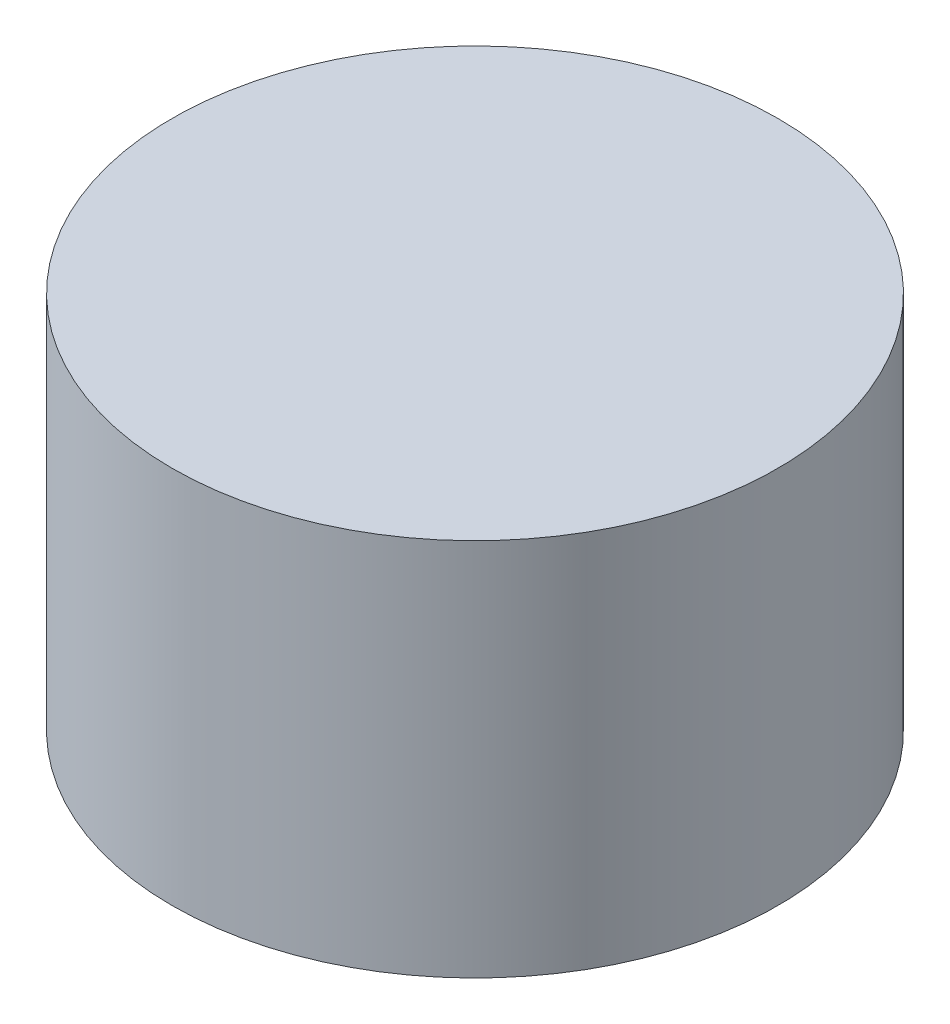
ISO-10303-21;
HEADER;
FILE_DESCRIPTION(('STEP AP214'),'2;1');
FILE_NAME('part.step','',(''),(''),'','','');
FILE_SCHEMA(('AUTOMOTIVE_DESIGN { 1 0 10303 214 1 1 1 1 }'));
ENDSEC;
DATA;
#1=APPLICATION_CONTEXT('core data for automotive mechanical design processes');
#2=APPLICATION_PROTOCOL_DEFINITION('international standard','automotive_design',2000,#1);
#3=PRODUCT_CONTEXT('',#1,'mechanical');
#4=PRODUCT('Part','Part','',(#3));
#5=PRODUCT_RELATED_PRODUCT_CATEGORY('part','',(#4));
#6=PRODUCT_DEFINITION_FORMATION('','',#4);
#7=PRODUCT_DEFINITION_CONTEXT('part definition',#1,'design');
#8=PRODUCT_DEFINITION('design','',#6,#7);
#9=PRODUCT_DEFINITION_SHAPE('','',#8);
#10=(LENGTH_UNIT() NAMED_UNIT(*) SI_UNIT(.MILLI.,.METRE.));
#11=(NAMED_UNIT(*) PLANE_ANGLE_UNIT() SI_UNIT($,.RADIAN.));
#12=(NAMED_UNIT(*) SI_UNIT($,.STERADIAN.) SOLID_ANGLE_UNIT());
#13=UNCERTAINTY_MEASURE_WITH_UNIT(LENGTH_MEASURE(1.E-05),#10,'distance_accuracy_value','');
#14=(GEOMETRIC_REPRESENTATION_CONTEXT(3) GLOBAL_UNCERTAINTY_ASSIGNED_CONTEXT((#13)) GLOBAL_UNIT_ASSIGNED_CONTEXT((#10,
#11,#12)) REPRESENTATION_CONTEXT('',''));
#15=CARTESIAN_POINT('',(0.,0.,0.));
#16=DIRECTION('',(0.,0.,1.));
#17=DIRECTION('',(1.,0.,0.));
#18=AXIS2_PLACEMENT_3D('',#15,#16,#17);
#19=CARTESIAN_POINT('',(0.,50.,0.));
#20=DIRECTION('',(0.,-1.,0.));
#21=DIRECTION('',(0.,0.,-1.));
#22=AXIS2_PLACEMENT_3D('',#19,#20,#21);
#23=CYLINDRICAL_SURFACE('',#22,40.);
#24=CARTESIAN_POINT('',(0.,50.,0.));
#25=DIRECTION('',(0.,1.,0.));
#26=DIRECTION('',(0.,0.,1.));
#27=AXIS2_PLACEMENT_3D('',#24,#25,#26);
#28=CIRCLE('',#27,40.);
#29=CARTESIAN_POINT('',(0.,50.,40.));
#30=VERTEX_POINT('',#29);
#31=EDGE_CURVE('E10',#30,#30,#28,.T.);
#32=ORIENTED_EDGE('',*,*,#31,.F.);
#33=EDGE_LOOP('',(#32));
#34=FACE_BOUND('',#33,.T.);
#35=CARTESIAN_POINT('',(0.,0.,0.));
#36=DIRECTION('',(0.,1.,0.));
#37=DIRECTION('',(0.,0.,1.));
#38=AXIS2_PLACEMENT_3D('',#35,#36,#37);
#39=CIRCLE('',#38,40.);
#40=CARTESIAN_POINT('',(0.,0.,40.));
#41=VERTEX_POINT('',#40);
#42=EDGE_CURVE('E44',#41,#41,#39,.T.);
#43=ORIENTED_EDGE('',*,*,#42,.T.);
#44=EDGE_LOOP('',(#43));
#45=FACE_BOUND('',#44,.T.);
#46=ADVANCED_FACE('F41',(#34,#45),#23,.T.);
#47=CARTESIAN_POINT('',(0.,50.,0.));
#48=DIRECTION('',(0.,1.,0.));
#49=DIRECTION('',(0.,0.,1.));
#50=AXIS2_PLACEMENT_3D('',#47,#48,#49);
#51=PLANE('',#50);
#52=ORIENTED_EDGE('',*,*,#31,.T.);
#53=EDGE_LOOP('',(#52));
#54=FACE_BOUND('',#53,.T.);
#55=ADVANCED_FACE('F83',(#54),#51,.T.);
#56=CARTESIAN_POINT('',(0.,0.,0.));
#57=DIRECTION('',(0.,1.,0.));
#58=DIRECTION('',(0.,0.,1.));
#59=AXIS2_PLACEMENT_3D('',#56,#57,#58);
#60=PLANE('',#59);
#61=CARTESIAN_POINT('',(-17.6776695296635,0.,17.6776695296638));
#62=DIRECTION('',(0.,-1.,0.));
#63=DIRECTION('',(0.,0.,-1.));
#64=AXIS2_PLACEMENT_3D('',#61,#62,#63);
#65=CIRCLE('',#64,3.);
#66=CARTESIAN_POINT('',(-17.6776695296635,0.,14.6776695296638));
#67=VERTEX_POINT('',#66);
#68=EDGE_CURVE('E62',#67,#67,#65,.T.);
#69=ORIENTED_EDGE('',*,*,#68,.F.);
#70=EDGE_LOOP('',(#69));
#71=FACE_BOUND('',#70,.T.);
#72=CARTESIAN_POINT('',(-17.6776695296638,0.,-17.6776695296636));
#73=DIRECTION('',(0.,-1.,0.));
#74=DIRECTION('',(0.,0.,-1.));
#75=AXIS2_PLACEMENT_3D('',#72,#73,#74);
#76=CIRCLE('',#75,3.);
#77=CARTESIAN_POINT('',(-17.6776695296638,0.,-20.6776695296636));
#78=VERTEX_POINT('',#77);
#79=EDGE_CURVE('E68',#78,#78,#76,.T.);
#80=ORIENTED_EDGE('',*,*,#79,.F.);
#81=EDGE_LOOP('',(#80));
#82=FACE_BOUND('',#81,.T.);
#83=CARTESIAN_POINT('',(17.6776695296637,0.,-17.6776695296637));
#84=DIRECTION('',(0.,-1.,0.));
#85=DIRECTION('',(0.,0.,-1.));
#86=AXIS2_PLACEMENT_3D('',#83,#84,#85);
#87=CIRCLE('',#86,3.);
#88=CARTESIAN_POINT('',(17.6776695296637,0.,-20.6776695296637));
#89=VERTEX_POINT('',#88);
#90=EDGE_CURVE('E56',#89,#89,#87,.T.);
#91=ORIENTED_EDGE('',*,*,#90,.F.);
#92=EDGE_LOOP('',(#91));
#93=FACE_BOUND('',#92,.T.);
#94=CARTESIAN_POINT('',(17.6776695296637,0.,17.6776695296637));
#95=DIRECTION('',(0.,-1.,0.));
#96=DIRECTION('',(0.,0.,-1.));
#97=AXIS2_PLACEMENT_3D('',#94,#95,#96);
#98=CIRCLE('',#97,3.);
#99=CARTESIAN_POINT('',(17.6776695296637,0.,14.6776695296637));
#100=VERTEX_POINT('',#99);
#101=EDGE_CURVE('E53',#100,#100,#98,.T.);
#102=ORIENTED_EDGE('',*,*,#101,.F.);
#103=EDGE_LOOP('',(#102));
#104=FACE_BOUND('',#103,.T.);
#105=ORIENTED_EDGE('',*,*,#42,.F.);
#106=EDGE_LOOP('',(#105));
#107=FACE_BOUND('',#106,.T.);
#108=ADVANCED_FACE('F79',(#71,#82,#93,#104,#107),#60,.F.);
#109=CARTESIAN_POINT('',(17.6776695296637,20.,17.6776695296637));
#110=DIRECTION('',(0.,-1.,0.));
#111=DIRECTION('',(0.,0.,-1.));
#112=AXIS2_PLACEMENT_3D('',#109,#110,#111);
#113=CYLINDRICAL_SURFACE('',#112,3.);
#114=CARTESIAN_POINT('',(17.6776695296637,20.,17.6776695296637));
#115=DIRECTION('',(0.,-1.,0.));
#116=DIRECTION('',(0.,0.,-1.));
#117=AXIS2_PLACEMENT_3D('',#114,#115,#116);
#118=CIRCLE('',#117,3.);
#119=CARTESIAN_POINT('',(17.6776695296637,20.,14.6776695296637));
#120=VERTEX_POINT('',#119);
#121=EDGE_CURVE('E51',#120,#120,#118,.T.);
#122=ORIENTED_EDGE('',*,*,#121,.F.);
#123=EDGE_LOOP('',(#122));
#124=FACE_BOUND('',#123,.T.);
#125=ORIENTED_EDGE('',*,*,#101,.T.);
#126=EDGE_LOOP('',(#125));
#127=FACE_BOUND('',#126,.T.);
#128=ADVANCED_FACE('F82',(#124,#127),#113,.F.);
#129=CARTESIAN_POINT('',(17.6776695296637,20.,17.6776695296637));
#130=DIRECTION('',(0.,-1.,0.));
#131=DIRECTION('',(0.,0.,-1.));
#132=AXIS2_PLACEMENT_3D('',#129,#130,#131);
#133=PLANE('',#132);
#134=ORIENTED_EDGE('',*,*,#121,.T.);
#135=EDGE_LOOP('',(#134));
#136=FACE_BOUND('',#135,.T.);
#137=ADVANCED_FACE('F100',(#136),#133,.T.);
#138=CARTESIAN_POINT('',(17.6776695296637,20.,-17.6776695296637));
#139=DIRECTION('',(0.,-1.,0.));
#140=DIRECTION('',(0.,0.,-1.));
#141=AXIS2_PLACEMENT_3D('',#138,#139,#140);
#142=CYLINDRICAL_SURFACE('',#141,3.);
#143=CARTESIAN_POINT('',(17.6776695296637,20.,-17.6776695296637));
#144=DIRECTION('',(0.,-1.,0.));
#145=DIRECTION('',(0.,0.,-1.));
#146=AXIS2_PLACEMENT_3D('',#143,#144,#145);
#147=CIRCLE('',#146,3.);
#148=CARTESIAN_POINT('',(17.6776695296637,20.,-20.6776695296637));
#149=VERTEX_POINT('',#148);
#150=EDGE_CURVE('E71',#149,#149,#147,.T.);
#151=ORIENTED_EDGE('',*,*,#150,.F.);
#152=EDGE_LOOP('',(#151));
#153=FACE_BOUND('',#152,.T.);
#154=ORIENTED_EDGE('',*,*,#90,.T.);
#155=EDGE_LOOP('',(#154));
#156=FACE_BOUND('',#155,.T.);
#157=ADVANCED_FACE('F77',(#153,#156),#142,.F.);
#158=CARTESIAN_POINT('',(17.6776695296637,20.,-17.6776695296637));
#159=DIRECTION('',(0.,-1.,0.));
#160=DIRECTION('',(0.,0.,-1.));
#161=AXIS2_PLACEMENT_3D('',#158,#159,#160);
#162=PLANE('',#161);
#163=ORIENTED_EDGE('',*,*,#150,.T.);
#164=EDGE_LOOP('',(#163));
#165=FACE_BOUND('',#164,.T.);
#166=ADVANCED_FACE('F120',(#165),#162,.T.);
#167=CARTESIAN_POINT('',(-17.6776695296638,20.,-17.6776695296636));
#168=DIRECTION('',(0.,-1.,0.));
#169=DIRECTION('',(0.,0.,-1.));
#170=AXIS2_PLACEMENT_3D('',#167,#168,#169);
#171=CYLINDRICAL_SURFACE('',#170,3.);
#172=CARTESIAN_POINT('',(-17.6776695296638,20.,-17.6776695296636));
#173=DIRECTION('',(0.,-1.,0.));
#174=DIRECTION('',(0.,0.,-1.));
#175=AXIS2_PLACEMENT_3D('',#172,#173,#174);
#176=CIRCLE('',#175,3.);
#177=CARTESIAN_POINT('',(-17.6776695296638,20.,-20.6776695296636));
#178=VERTEX_POINT('',#177);
#179=EDGE_CURVE('E65',#178,#178,#176,.T.);
#180=ORIENTED_EDGE('',*,*,#179,.F.);
#181=EDGE_LOOP('',(#180));
#182=FACE_BOUND('',#181,.T.);
#183=ORIENTED_EDGE('',*,*,#79,.T.);
#184=EDGE_LOOP('',(#183));
#185=FACE_BOUND('',#184,.T.);
#186=ADVANCED_FACE('F116',(#182,#185),#171,.F.);
#187=CARTESIAN_POINT('',(-17.6776695296638,20.,-17.6776695296636));
#188=DIRECTION('',(0.,-1.,0.));
#189=DIRECTION('',(0.,0.,-1.));
#190=AXIS2_PLACEMENT_3D('',#187,#188,#189);
#191=PLANE('',#190);
#192=ORIENTED_EDGE('',*,*,#179,.T.);
#193=EDGE_LOOP('',(#192));
#194=FACE_BOUND('',#193,.T.);
#195=ADVANCED_FACE('F112',(#194),#191,.T.);
#196=CARTESIAN_POINT('',(-17.6776695296635,20.,17.6776695296638));
#197=DIRECTION('',(0.,-1.,0.));
#198=DIRECTION('',(0.,0.,-1.));
#199=AXIS2_PLACEMENT_3D('',#196,#197,#198);
#200=CYLINDRICAL_SURFACE('',#199,3.);
#201=CARTESIAN_POINT('',(-17.6776695296635,20.,17.6776695296638));
#202=DIRECTION('',(0.,-1.,0.));
#203=DIRECTION('',(0.,0.,-1.));
#204=AXIS2_PLACEMENT_3D('',#201,#202,#203);
#205=CIRCLE('',#204,3.);
#206=CARTESIAN_POINT('',(-17.6776695296635,20.,14.6776695296638));
#207=VERTEX_POINT('',#206);
#208=EDGE_CURVE('E59',#207,#207,#205,.T.);
#209=ORIENTED_EDGE('',*,*,#208,.F.);
#210=EDGE_LOOP('',(#209));
#211=FACE_BOUND('',#210,.T.);
#212=ORIENTED_EDGE('',*,*,#68,.T.);
#213=EDGE_LOOP('',(#212));
#214=FACE_BOUND('',#213,.T.);
#215=ADVANCED_FACE('F108',(#211,#214),#200,.F.);
#216=CARTESIAN_POINT('',(-17.6776695296635,20.,17.6776695296638));
#217=DIRECTION('',(0.,-1.,0.));
#218=DIRECTION('',(0.,0.,-1.));
#219=AXIS2_PLACEMENT_3D('',#216,#217,#218);
#220=PLANE('',#219);
#221=ORIENTED_EDGE('',*,*,#208,.T.);
#222=EDGE_LOOP('',(#221));
#223=FACE_BOUND('',#222,.T.);
#224=ADVANCED_FACE('F105',(#223),#220,.T.);
#225=CLOSED_SHELL('',(#46,#55,#108,#128,#137,#157,#166,#186,#195,#215,#224));
#226=MANIFOLD_SOLID_BREP('B2',#225);
#227=ADVANCED_BREP_SHAPE_REPRESENTATION('',(#18,#226),#14);
#228=SHAPE_DEFINITION_REPRESENTATION(#9,#227);
ENDSEC;
END-ISO-10303-21;
